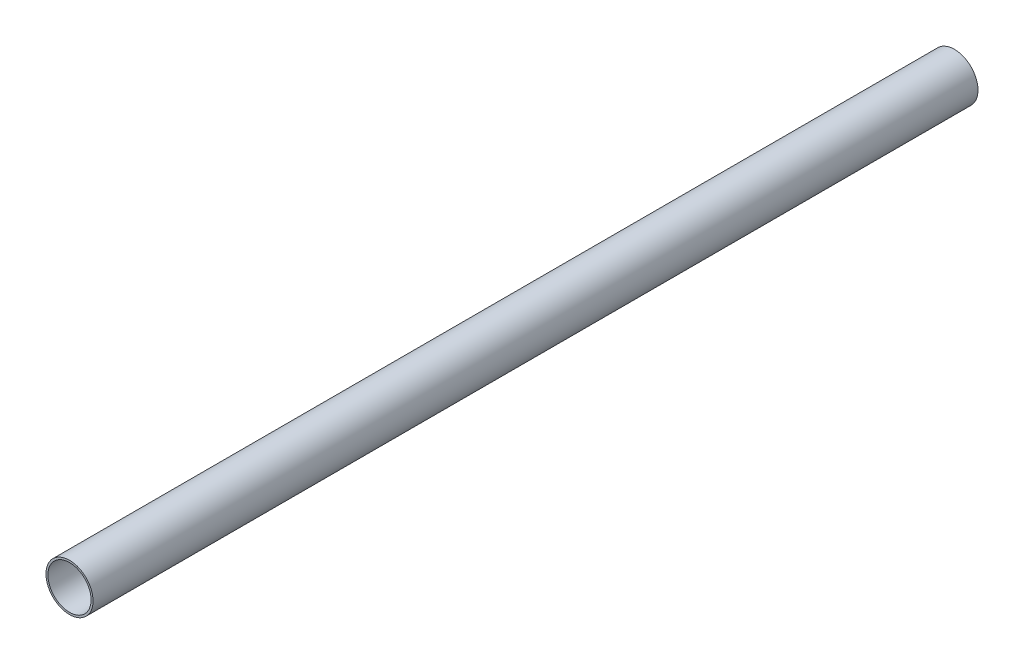
ISO-10303-21;
HEADER;
FILE_DESCRIPTION(('STEP AP214'),'2;1');
FILE_NAME('part.step','',(''),(''),'','','');
FILE_SCHEMA(('AUTOMOTIVE_DESIGN { 1 0 10303 214 1 1 1 1 }'));
ENDSEC;
DATA;
#1=APPLICATION_CONTEXT('core data for automotive mechanical design processes');
#2=APPLICATION_PROTOCOL_DEFINITION('international standard','automotive_design',2000,#1);
#3=PRODUCT_CONTEXT('',#1,'mechanical');
#4=PRODUCT('Part','Part','',(#3));
#5=PRODUCT_RELATED_PRODUCT_CATEGORY('part','',(#4));
#6=PRODUCT_DEFINITION_FORMATION('','',#4);
#7=PRODUCT_DEFINITION_CONTEXT('part definition',#1,'design');
#8=PRODUCT_DEFINITION('design','',#6,#7);
#9=PRODUCT_DEFINITION_SHAPE('','',#8);
#10=(LENGTH_UNIT() NAMED_UNIT(*) SI_UNIT(.MILLI.,.METRE.));
#11=(NAMED_UNIT(*) PLANE_ANGLE_UNIT() SI_UNIT($,.RADIAN.));
#12=(NAMED_UNIT(*) SI_UNIT($,.STERADIAN.) SOLID_ANGLE_UNIT());
#13=UNCERTAINTY_MEASURE_WITH_UNIT(LENGTH_MEASURE(1.E-05),#10,'distance_accuracy_value','');
#14=(GEOMETRIC_REPRESENTATION_CONTEXT(3) GLOBAL_UNCERTAINTY_ASSIGNED_CONTEXT((#13)) GLOBAL_UNIT_ASSIGNED_CONTEXT((#10,
#11,#12)) REPRESENTATION_CONTEXT('',''));
#15=CARTESIAN_POINT('',(0.,0.,0.));
#16=DIRECTION('',(0.,0.,1.));
#17=DIRECTION('',(1.,0.,0.));
#18=AXIS2_PLACEMENT_3D('',#15,#16,#17);
#19=CARTESIAN_POINT('',(0.,0.,451.));
#20=DIRECTION('',(0.,0.,1.));
#21=DIRECTION('',(1.,0.,0.));
#22=AXIS2_PLACEMENT_3D('',#19,#20,#21);
#23=PLANE('',#22);
#24=CARTESIAN_POINT('',(0.,0.,451.));
#25=DIRECTION('',(0.,0.,1.));
#26=DIRECTION('',(1.,0.,0.));
#27=AXIS2_PLACEMENT_3D('',#24,#25,#26);
#28=CIRCLE('',#27,12.);
#29=CARTESIAN_POINT('',(12.,0.,451.));
#30=VERTEX_POINT('',#29);
#31=EDGE_CURVE('E10',#30,#30,#28,.T.);
#32=ORIENTED_EDGE('',*,*,#31,.T.);
#33=EDGE_LOOP('',(#32));
#34=FACE_BOUND('',#33,.T.);
#35=CARTESIAN_POINT('',(0.,0.,451.));
#36=DIRECTION('',(0.,0.,1.));
#37=DIRECTION('',(1.,0.,0.));
#38=AXIS2_PLACEMENT_3D('',#35,#36,#37);
#39=CIRCLE('',#38,11.);
#40=CARTESIAN_POINT('',(11.,0.,451.));
#41=VERTEX_POINT('',#40);
#42=EDGE_CURVE('E45',#41,#41,#39,.T.);
#43=ORIENTED_EDGE('',*,*,#42,.F.);
#44=EDGE_LOOP('',(#43));
#45=FACE_BOUND('',#44,.T.);
#46=ADVANCED_FACE('F34',(#34,#45),#23,.T.);
#47=CARTESIAN_POINT('',(0.,0.,0.));
#48=DIRECTION('',(0.,0.,1.));
#49=DIRECTION('',(1.,0.,0.));
#50=AXIS2_PLACEMENT_3D('',#47,#48,#49);
#51=PLANE('',#50);
#52=CARTESIAN_POINT('',(0.,0.,0.));
#53=DIRECTION('',(0.,0.,1.));
#54=DIRECTION('',(1.,0.,0.));
#55=AXIS2_PLACEMENT_3D('',#52,#53,#54);
#56=CIRCLE('',#55,12.);
#57=CARTESIAN_POINT('',(12.,0.,0.));
#58=VERTEX_POINT('',#57);
#59=EDGE_CURVE('E38',#58,#58,#56,.T.);
#60=ORIENTED_EDGE('',*,*,#59,.F.);
#61=EDGE_LOOP('',(#60));
#62=FACE_BOUND('',#61,.T.);
#63=CARTESIAN_POINT('',(0.,0.,0.));
#64=DIRECTION('',(0.,0.,1.));
#65=DIRECTION('',(1.,0.,0.));
#66=AXIS2_PLACEMENT_3D('',#63,#64,#65);
#67=CIRCLE('',#66,11.);
#68=CARTESIAN_POINT('',(11.,0.,0.));
#69=VERTEX_POINT('',#68);
#70=EDGE_CURVE('E47',#69,#69,#67,.T.);
#71=ORIENTED_EDGE('',*,*,#70,.T.);
#72=EDGE_LOOP('',(#71));
#73=FACE_BOUND('',#72,.T.);
#74=ADVANCED_FACE('F57',(#62,#73),#51,.F.);
#75=CARTESIAN_POINT('',(0.,0.,451.));
#76=DIRECTION('',(0.,0.,-1.));
#77=DIRECTION('',(-1.,0.,0.));
#78=AXIS2_PLACEMENT_3D('',#75,#76,#77);
#79=CYLINDRICAL_SURFACE('',#78,12.);
#80=ORIENTED_EDGE('',*,*,#31,.F.);
#81=EDGE_LOOP('',(#80));
#82=FACE_BOUND('',#81,.T.);
#83=ORIENTED_EDGE('',*,*,#59,.T.);
#84=EDGE_LOOP('',(#83));
#85=FACE_BOUND('',#84,.T.);
#86=ADVANCED_FACE('F36',(#82,#85),#79,.T.);
#87=CARTESIAN_POINT('',(0.,0.,451.));
#88=DIRECTION('',(0.,0.,-1.));
#89=DIRECTION('',(-1.,0.,0.));
#90=AXIS2_PLACEMENT_3D('',#87,#88,#89);
#91=CYLINDRICAL_SURFACE('',#90,11.);
#92=ORIENTED_EDGE('',*,*,#42,.T.);
#93=EDGE_LOOP('',(#92));
#94=FACE_BOUND('',#93,.T.);
#95=ORIENTED_EDGE('',*,*,#70,.F.);
#96=EDGE_LOOP('',(#95));
#97=FACE_BOUND('',#96,.T.);
#98=ADVANCED_FACE('F53',(#94,#97),#91,.F.);
#99=CLOSED_SHELL('',(#46,#74,#86,#98));
#100=MANIFOLD_SOLID_BREP('B2',#99);
#101=ADVANCED_BREP_SHAPE_REPRESENTATION('',(#18,#100),#14);
#102=SHAPE_DEFINITION_REPRESENTATION(#9,#101);
ENDSEC;
END-ISO-10303-21;
